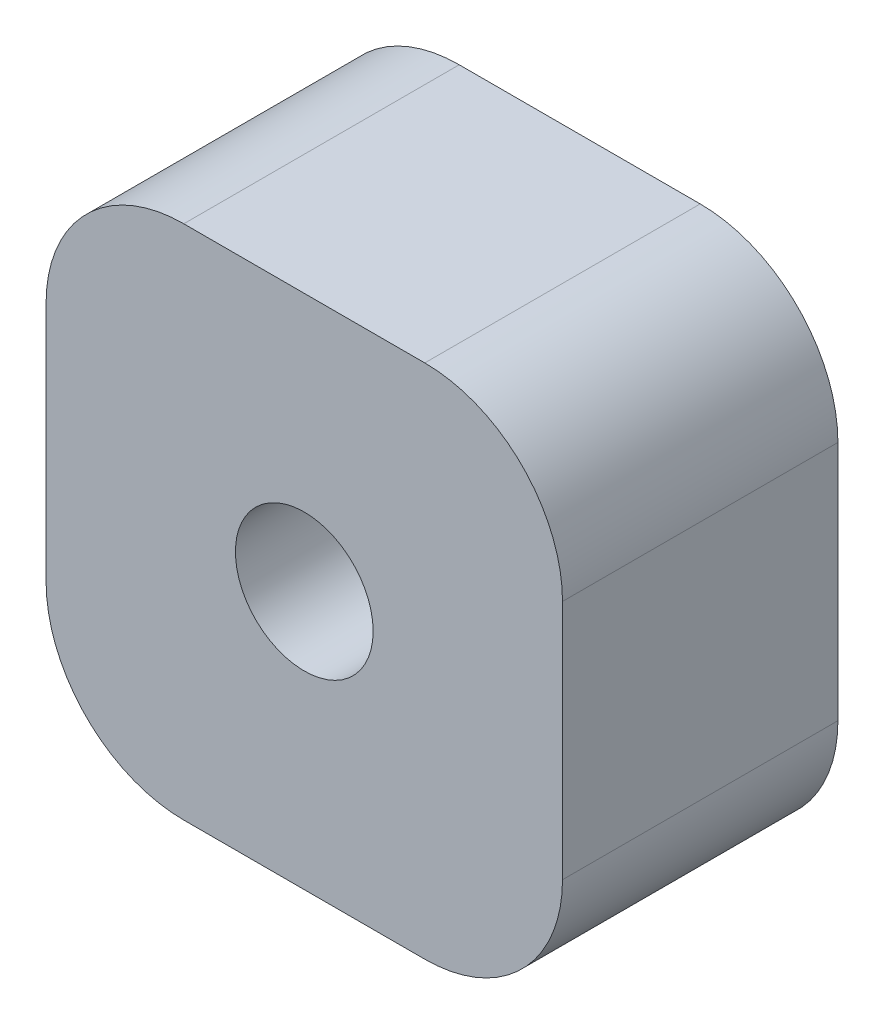
ISO-10303-21;
HEADER;
FILE_DESCRIPTION(('STEP AP214'),'2;1');
FILE_NAME('part.step','',(''),(''),'','','');
FILE_SCHEMA(('AUTOMOTIVE_DESIGN { 1 0 10303 214 1 1 1 1 }'));
ENDSEC;
DATA;
#1=APPLICATION_CONTEXT('core data for automotive mechanical design processes');
#2=APPLICATION_PROTOCOL_DEFINITION('international standard','automotive_design',2000,#1);
#3=PRODUCT_CONTEXT('',#1,'mechanical');
#4=PRODUCT('Part','Part','',(#3));
#5=PRODUCT_RELATED_PRODUCT_CATEGORY('part','',(#4));
#6=PRODUCT_DEFINITION_FORMATION('','',#4);
#7=PRODUCT_DEFINITION_CONTEXT('part definition',#1,'design');
#8=PRODUCT_DEFINITION('design','',#6,#7);
#9=PRODUCT_DEFINITION_SHAPE('','',#8);
#10=(LENGTH_UNIT() NAMED_UNIT(*) SI_UNIT(.MILLI.,.METRE.));
#11=(NAMED_UNIT(*) PLANE_ANGLE_UNIT() SI_UNIT($,.RADIAN.));
#12=(NAMED_UNIT(*) SI_UNIT($,.STERADIAN.) SOLID_ANGLE_UNIT());
#13=UNCERTAINTY_MEASURE_WITH_UNIT(LENGTH_MEASURE(1.E-05),#10,'distance_accuracy_value','');
#14=(GEOMETRIC_REPRESENTATION_CONTEXT(3) GLOBAL_UNCERTAINTY_ASSIGNED_CONTEXT((#13)) GLOBAL_UNIT_ASSIGNED_CONTEXT((#10,
#11,#12)) REPRESENTATION_CONTEXT('',''));
#15=CARTESIAN_POINT('',(0.,0.,0.));
#16=DIRECTION('',(0.,0.,1.));
#17=DIRECTION('',(1.,0.,0.));
#18=AXIS2_PLACEMENT_3D('',#15,#16,#17);
#19=CARTESIAN_POINT('',(0.,0.,8.));
#20=DIRECTION('',(0.,0.,-1.));
#21=DIRECTION('',(-1.,0.,0.));
#22=AXIS2_PLACEMENT_3D('',#19,#20,#21);
#23=PLANE('',#22);
#24=DIRECTION('',(1.,0.,0.));
#25=VECTOR('',#24,1.);
#26=CARTESIAN_POINT('',(-7.5,-7.5,8.));
#27=LINE('',#26,#25);
#28=CARTESIAN_POINT('',(-3.5,-7.5,8.));
#29=VERTEX_POINT('',#28);
#30=CARTESIAN_POINT('',(3.5,-7.5,8.));
#31=VERTEX_POINT('',#30);
#32=EDGE_CURVE('E137',#29,#31,#27,.T.);
#33=ORIENTED_EDGE('',*,*,#32,.T.);
#34=CARTESIAN_POINT('',(3.5,-3.5,8.));
#35=DIRECTION('',(0.,0.,-1.));
#36=DIRECTION('',(-1.,0.,0.));
#37=AXIS2_PLACEMENT_3D('',#34,#35,#36);
#38=CIRCLE('',#37,4.);
#39=CARTESIAN_POINT('',(7.5,-3.5,8.));
#40=VERTEX_POINT('',#39);
#41=EDGE_CURVE('E156',#31,#40,#38,.F.);
#42=ORIENTED_EDGE('',*,*,#41,.T.);
#43=DIRECTION('',(0.,1.,0.));
#44=VECTOR('',#43,1.);
#45=CARTESIAN_POINT('',(7.5,-7.5,8.));
#46=LINE('',#45,#44);
#47=CARTESIAN_POINT('',(7.5,3.5,8.));
#48=VERTEX_POINT('',#47);
#49=EDGE_CURVE('E120',#40,#48,#46,.T.);
#50=ORIENTED_EDGE('',*,*,#49,.T.);
#51=CARTESIAN_POINT('',(3.5,3.5,8.));
#52=DIRECTION('',(0.,0.,-1.));
#53=DIRECTION('',(-1.,0.,0.));
#54=AXIS2_PLACEMENT_3D('',#51,#52,#53);
#55=CIRCLE('',#54,4.);
#56=CARTESIAN_POINT('',(3.5,7.5,8.));
#57=VERTEX_POINT('',#56);
#58=EDGE_CURVE('E154',#48,#57,#55,.F.);
#59=ORIENTED_EDGE('',*,*,#58,.T.);
#60=DIRECTION('',(-1.,0.,0.));
#61=VECTOR('',#60,1.);
#62=CARTESIAN_POINT('',(-7.5,7.5,8.));
#63=LINE('',#62,#61);
#64=CARTESIAN_POINT('',(-3.5,7.5,8.));
#65=VERTEX_POINT('',#64);
#66=EDGE_CURVE('E167',#57,#65,#63,.T.);
#67=ORIENTED_EDGE('',*,*,#66,.T.);
#68=CARTESIAN_POINT('',(-3.5,3.5,8.));
#69=DIRECTION('',(0.,0.,-1.));
#70=DIRECTION('',(-1.,0.,0.));
#71=AXIS2_PLACEMENT_3D('',#68,#69,#70);
#72=CIRCLE('',#71,4.);
#73=CARTESIAN_POINT('',(-7.5,3.5,8.));
#74=VERTEX_POINT('',#73);
#75=EDGE_CURVE('E55',#65,#74,#72,.F.);
#76=ORIENTED_EDGE('',*,*,#75,.T.);
#77=DIRECTION('',(0.,-1.,0.));
#78=VECTOR('',#77,1.);
#79=CARTESIAN_POINT('',(-7.5,-7.5,8.));
#80=LINE('',#79,#78);
#81=CARTESIAN_POINT('',(-7.5,-3.5,8.));
#82=VERTEX_POINT('',#81);
#83=EDGE_CURVE('E175',#74,#82,#80,.T.);
#84=ORIENTED_EDGE('',*,*,#83,.T.);
#85=CARTESIAN_POINT('',(-3.5,-3.5,8.));
#86=DIRECTION('',(0.,0.,-1.));
#87=DIRECTION('',(-1.,0.,0.));
#88=AXIS2_PLACEMENT_3D('',#85,#86,#87);
#89=CIRCLE('',#88,4.);
#90=EDGE_CURVE('E151',#82,#29,#89,.F.);
#91=ORIENTED_EDGE('',*,*,#90,.T.);
#92=EDGE_LOOP('',(#33,#42,#50,#59,#67,#76,#84,#91));
#93=FACE_BOUND('',#92,.T.);
#94=CARTESIAN_POINT('',(0.,0.,8.));
#95=DIRECTION('',(0.,0.,1.));
#96=DIRECTION('',(1.,0.,0.));
#97=AXIS2_PLACEMENT_3D('',#94,#95,#96);
#98=CIRCLE('',#97,2.);
#99=CARTESIAN_POINT('',(2.,0.,8.));
#100=VERTEX_POINT('',#99);
#101=EDGE_CURVE('E128',#100,#100,#98,.T.);
#102=ORIENTED_EDGE('',*,*,#101,.F.);
#103=EDGE_LOOP('',(#102));
#104=FACE_BOUND('',#103,.T.);
#105=ADVANCED_FACE('F34',(#93,#104),#23,.F.);
#106=CARTESIAN_POINT('',(0.,0.,0.));
#107=DIRECTION('',(0.,0.,-1.));
#108=DIRECTION('',(-1.,0.,0.));
#109=AXIS2_PLACEMENT_3D('',#106,#107,#108);
#110=PLANE('',#109);
#111=DIRECTION('',(0.,1.,0.));
#112=VECTOR('',#111,1.);
#113=CARTESIAN_POINT('',(7.5,-7.5,0.));
#114=LINE('',#113,#112);
#115=CARTESIAN_POINT('',(7.5,-3.5,0.));
#116=VERTEX_POINT('',#115);
#117=CARTESIAN_POINT('',(7.5,3.5,0.));
#118=VERTEX_POINT('',#117);
#119=EDGE_CURVE('E117',#116,#118,#114,.T.);
#120=ORIENTED_EDGE('',*,*,#119,.F.);
#121=CARTESIAN_POINT('',(3.5,-3.5,0.));
#122=DIRECTION('',(0.,0.,-1.));
#123=DIRECTION('',(-1.,0.,0.));
#124=AXIS2_PLACEMENT_3D('',#121,#122,#123);
#125=CIRCLE('',#124,4.);
#126=CARTESIAN_POINT('',(3.5,-7.5,0.));
#127=VERTEX_POINT('',#126);
#128=EDGE_CURVE('E100',#116,#127,#125,.T.);
#129=ORIENTED_EDGE('',*,*,#128,.T.);
#130=DIRECTION('',(1.,0.,0.));
#131=VECTOR('',#130,1.);
#132=CARTESIAN_POINT('',(-7.5,-7.5,0.));
#133=LINE('',#132,#131);
#134=CARTESIAN_POINT('',(-3.5,-7.5,0.));
#135=VERTEX_POINT('',#134);
#136=EDGE_CURVE('E141',#135,#127,#133,.T.);
#137=ORIENTED_EDGE('',*,*,#136,.F.);
#138=CARTESIAN_POINT('',(-3.5,-3.5,0.));
#139=DIRECTION('',(0.,0.,-1.));
#140=DIRECTION('',(-1.,0.,0.));
#141=AXIS2_PLACEMENT_3D('',#138,#139,#140);
#142=CIRCLE('',#141,4.);
#143=CARTESIAN_POINT('',(-7.5,-3.5,0.));
#144=VERTEX_POINT('',#143);
#145=EDGE_CURVE('E121',#135,#144,#142,.T.);
#146=ORIENTED_EDGE('',*,*,#145,.T.);
#147=DIRECTION('',(0.,-1.,0.));
#148=VECTOR('',#147,1.);
#149=CARTESIAN_POINT('',(-7.5,-7.5,0.));
#150=LINE('',#149,#148);
#151=CARTESIAN_POINT('',(-7.5,3.5,0.));
#152=VERTEX_POINT('',#151);
#153=EDGE_CURVE('E131',#152,#144,#150,.T.);
#154=ORIENTED_EDGE('',*,*,#153,.F.);
#155=CARTESIAN_POINT('',(-3.5,3.5,0.));
#156=DIRECTION('',(0.,0.,-1.));
#157=DIRECTION('',(-1.,0.,0.));
#158=AXIS2_PLACEMENT_3D('',#155,#156,#157);
#159=CIRCLE('',#158,4.);
#160=CARTESIAN_POINT('',(-3.5,7.5,0.));
#161=VERTEX_POINT('',#160);
#162=EDGE_CURVE('E145',#152,#161,#159,.T.);
#163=ORIENTED_EDGE('',*,*,#162,.T.);
#164=DIRECTION('',(-1.,0.,0.));
#165=VECTOR('',#164,1.);
#166=CARTESIAN_POINT('',(-7.5,7.5,0.));
#167=LINE('',#166,#165);
#168=CARTESIAN_POINT('',(3.5,7.5,0.));
#169=VERTEX_POINT('',#168);
#170=EDGE_CURVE('E127',#169,#161,#167,.T.);
#171=ORIENTED_EDGE('',*,*,#170,.F.);
#172=CARTESIAN_POINT('',(3.5,3.5,0.));
#173=DIRECTION('',(0.,0.,-1.));
#174=DIRECTION('',(-1.,0.,0.));
#175=AXIS2_PLACEMENT_3D('',#172,#173,#174);
#176=CIRCLE('',#175,4.);
#177=EDGE_CURVE('E111',#169,#118,#176,.T.);
#178=ORIENTED_EDGE('',*,*,#177,.T.);
#179=EDGE_LOOP('',(#120,#129,#137,#146,#154,#163,#171,#178));
#180=FACE_BOUND('',#179,.T.);
#181=CARTESIAN_POINT('',(0.,0.,0.));
#182=DIRECTION('',(0.,0.,1.));
#183=DIRECTION('',(1.,0.,0.));
#184=AXIS2_PLACEMENT_3D('',#181,#182,#183);
#185=CIRCLE('',#184,2.);
#186=CARTESIAN_POINT('',(2.,0.,0.));
#187=VERTEX_POINT('',#186);
#188=EDGE_CURVE('E134',#187,#187,#185,.T.);
#189=ORIENTED_EDGE('',*,*,#188,.T.);
#190=EDGE_LOOP('',(#189));
#191=FACE_BOUND('',#190,.T.);
#192=ADVANCED_FACE('F124',(#180,#191),#110,.T.);
#193=CARTESIAN_POINT('',(7.5,-7.5,8.));
#194=DIRECTION('',(-1.,0.,0.));
#195=DIRECTION('',(0.,0.,1.));
#196=AXIS2_PLACEMENT_3D('',#193,#194,#195);
#197=PLANE('',#196);
#198=ORIENTED_EDGE('',*,*,#49,.F.);
#199=DIRECTION('',(0.,0.,-1.));
#200=VECTOR('',#199,1.);
#201=CARTESIAN_POINT('',(7.5,-3.5,8.));
#202=LINE('',#201,#200);
#203=EDGE_CURVE('E104',#40,#116,#202,.T.);
#204=ORIENTED_EDGE('',*,*,#203,.T.);
#205=ORIENTED_EDGE('',*,*,#119,.T.);
#206=DIRECTION('',(0.,0.,-1.));
#207=VECTOR('',#206,1.);
#208=CARTESIAN_POINT('',(7.5,3.5,8.));
#209=LINE('',#208,#207);
#210=EDGE_CURVE('E122',#118,#48,#209,.F.);
#211=ORIENTED_EDGE('',*,*,#210,.T.);
#212=EDGE_LOOP('',(#198,#204,#205,#211));
#213=FACE_BOUND('',#212,.T.);
#214=ADVANCED_FACE('F116',(#213),#197,.F.);
#215=CARTESIAN_POINT('',(-7.5,7.5,8.));
#216=DIRECTION('',(0.,-1.,0.));
#217=DIRECTION('',(0.,0.,-1.));
#218=AXIS2_PLACEMENT_3D('',#215,#216,#217);
#219=PLANE('',#218);
#220=ORIENTED_EDGE('',*,*,#66,.F.);
#221=DIRECTION('',(0.,0.,-1.));
#222=VECTOR('',#221,1.);
#223=CARTESIAN_POINT('',(3.5,7.5,8.));
#224=LINE('',#223,#222);
#225=EDGE_CURVE('E160',#57,#169,#224,.T.);
#226=ORIENTED_EDGE('',*,*,#225,.T.);
#227=ORIENTED_EDGE('',*,*,#170,.T.);
#228=DIRECTION('',(0.,0.,-1.));
#229=VECTOR('',#228,1.);
#230=CARTESIAN_POINT('',(-3.5,7.5,8.));
#231=LINE('',#230,#229);
#232=EDGE_CURVE('E158',#161,#65,#231,.F.);
#233=ORIENTED_EDGE('',*,*,#232,.T.);
#234=EDGE_LOOP('',(#220,#226,#227,#233));
#235=FACE_BOUND('',#234,.T.);
#236=ADVANCED_FACE('F165',(#235),#219,.F.);
#237=CARTESIAN_POINT('',(-7.5,-7.5,8.));
#238=DIRECTION('',(1.,0.,0.));
#239=DIRECTION('',(0.,0.,-1.));
#240=AXIS2_PLACEMENT_3D('',#237,#238,#239);
#241=PLANE('',#240);
#242=ORIENTED_EDGE('',*,*,#83,.F.);
#243=DIRECTION('',(0.,0.,-1.));
#244=VECTOR('',#243,1.);
#245=CARTESIAN_POINT('',(-7.5,3.5,8.));
#246=LINE('',#245,#244);
#247=EDGE_CURVE('E11',#74,#152,#246,.T.);
#248=ORIENTED_EDGE('',*,*,#247,.T.);
#249=ORIENTED_EDGE('',*,*,#153,.T.);
#250=DIRECTION('',(0.,0.,-1.));
#251=VECTOR('',#250,1.);
#252=CARTESIAN_POINT('',(-7.5,-3.5,8.));
#253=LINE('',#252,#251);
#254=EDGE_CURVE('E42',#144,#82,#253,.F.);
#255=ORIENTED_EDGE('',*,*,#254,.T.);
#256=EDGE_LOOP('',(#242,#248,#249,#255));
#257=FACE_BOUND('',#256,.T.);
#258=ADVANCED_FACE('F174',(#257),#241,.F.);
#259=CARTESIAN_POINT('',(-7.5,-7.5,8.));
#260=DIRECTION('',(0.,1.,0.));
#261=DIRECTION('',(0.,0.,1.));
#262=AXIS2_PLACEMENT_3D('',#259,#260,#261);
#263=PLANE('',#262);
#264=ORIENTED_EDGE('',*,*,#136,.T.);
#265=DIRECTION('',(0.,0.,-1.));
#266=VECTOR('',#265,1.);
#267=CARTESIAN_POINT('',(3.5,-7.5,8.));
#268=LINE('',#267,#266);
#269=EDGE_CURVE('E105',#127,#31,#268,.F.);
#270=ORIENTED_EDGE('',*,*,#269,.T.);
#271=ORIENTED_EDGE('',*,*,#32,.F.);
#272=DIRECTION('',(0.,0.,-1.));
#273=VECTOR('',#272,1.);
#274=CARTESIAN_POINT('',(-3.5,-7.5,8.));
#275=LINE('',#274,#273);
#276=EDGE_CURVE('E110',#29,#135,#275,.T.);
#277=ORIENTED_EDGE('',*,*,#276,.T.);
#278=EDGE_LOOP('',(#264,#270,#271,#277));
#279=FACE_BOUND('',#278,.T.);
#280=ADVANCED_FACE('F186',(#279),#263,.F.);
#281=CARTESIAN_POINT('',(0.,0.,8.));
#282=DIRECTION('',(0.,0.,-1.));
#283=DIRECTION('',(-1.,0.,0.));
#284=AXIS2_PLACEMENT_3D('',#281,#282,#283);
#285=CYLINDRICAL_SURFACE('',#284,2.);
#286=ORIENTED_EDGE('',*,*,#101,.T.);
#287=EDGE_LOOP('',(#286));
#288=FACE_BOUND('',#287,.T.);
#289=ORIENTED_EDGE('',*,*,#188,.F.);
#290=EDGE_LOOP('',(#289));
#291=FACE_BOUND('',#290,.T.);
#292=ADVANCED_FACE('F184',(#288,#291),#285,.F.);
#293=CARTESIAN_POINT('',(3.5,-3.5,8.));
#294=DIRECTION('',(0.,0.,-1.));
#295=DIRECTION('',(-1.,0.,0.));
#296=AXIS2_PLACEMENT_3D('',#293,#294,#295);
#297=CYLINDRICAL_SURFACE('',#296,4.);
#298=ORIENTED_EDGE('',*,*,#41,.F.);
#299=ORIENTED_EDGE('',*,*,#269,.F.);
#300=ORIENTED_EDGE('',*,*,#128,.F.);
#301=ORIENTED_EDGE('',*,*,#203,.F.);
#302=EDGE_LOOP('',(#298,#299,#300,#301));
#303=FACE_BOUND('',#302,.T.);
#304=ADVANCED_FACE('F103',(#303),#297,.T.);
#305=CARTESIAN_POINT('',(3.5,3.5,8.));
#306=DIRECTION('',(0.,0.,-1.));
#307=DIRECTION('',(-1.,0.,0.));
#308=AXIS2_PLACEMENT_3D('',#305,#306,#307);
#309=CYLINDRICAL_SURFACE('',#308,4.);
#310=ORIENTED_EDGE('',*,*,#58,.F.);
#311=ORIENTED_EDGE('',*,*,#210,.F.);
#312=ORIENTED_EDGE('',*,*,#177,.F.);
#313=ORIENTED_EDGE('',*,*,#225,.F.);
#314=EDGE_LOOP('',(#310,#311,#312,#313));
#315=FACE_BOUND('',#314,.T.);
#316=ADVANCED_FACE('F193',(#315),#309,.T.);
#317=CARTESIAN_POINT('',(-3.5,3.5,8.));
#318=DIRECTION('',(0.,0.,-1.));
#319=DIRECTION('',(-1.,0.,0.));
#320=AXIS2_PLACEMENT_3D('',#317,#318,#319);
#321=CYLINDRICAL_SURFACE('',#320,4.);
#322=ORIENTED_EDGE('',*,*,#75,.F.);
#323=ORIENTED_EDGE('',*,*,#232,.F.);
#324=ORIENTED_EDGE('',*,*,#162,.F.);
#325=ORIENTED_EDGE('',*,*,#247,.F.);
#326=EDGE_LOOP('',(#322,#323,#324,#325));
#327=FACE_BOUND('',#326,.T.);
#328=ADVANCED_FACE('F173',(#327),#321,.T.);
#329=CARTESIAN_POINT('',(-3.5,-3.5,8.));
#330=DIRECTION('',(0.,0.,-1.));
#331=DIRECTION('',(-1.,0.,0.));
#332=AXIS2_PLACEMENT_3D('',#329,#330,#331);
#333=CYLINDRICAL_SURFACE('',#332,4.);
#334=ORIENTED_EDGE('',*,*,#90,.F.);
#335=ORIENTED_EDGE('',*,*,#254,.F.);
#336=ORIENTED_EDGE('',*,*,#145,.F.);
#337=ORIENTED_EDGE('',*,*,#276,.F.);
#338=EDGE_LOOP('',(#334,#335,#336,#337));
#339=FACE_BOUND('',#338,.T.);
#340=ADVANCED_FACE('F36',(#339),#333,.T.);
#341=CLOSED_SHELL('',(#105,#192,#214,#236,#258,#280,#292,#304,#316,#328,#340));
#342=MANIFOLD_SOLID_BREP('B2',#341);
#343=ADVANCED_BREP_SHAPE_REPRESENTATION('',(#18,#342),#14);
#344=SHAPE_DEFINITION_REPRESENTATION(#9,#343);
ENDSEC;
END-ISO-10303-21;
